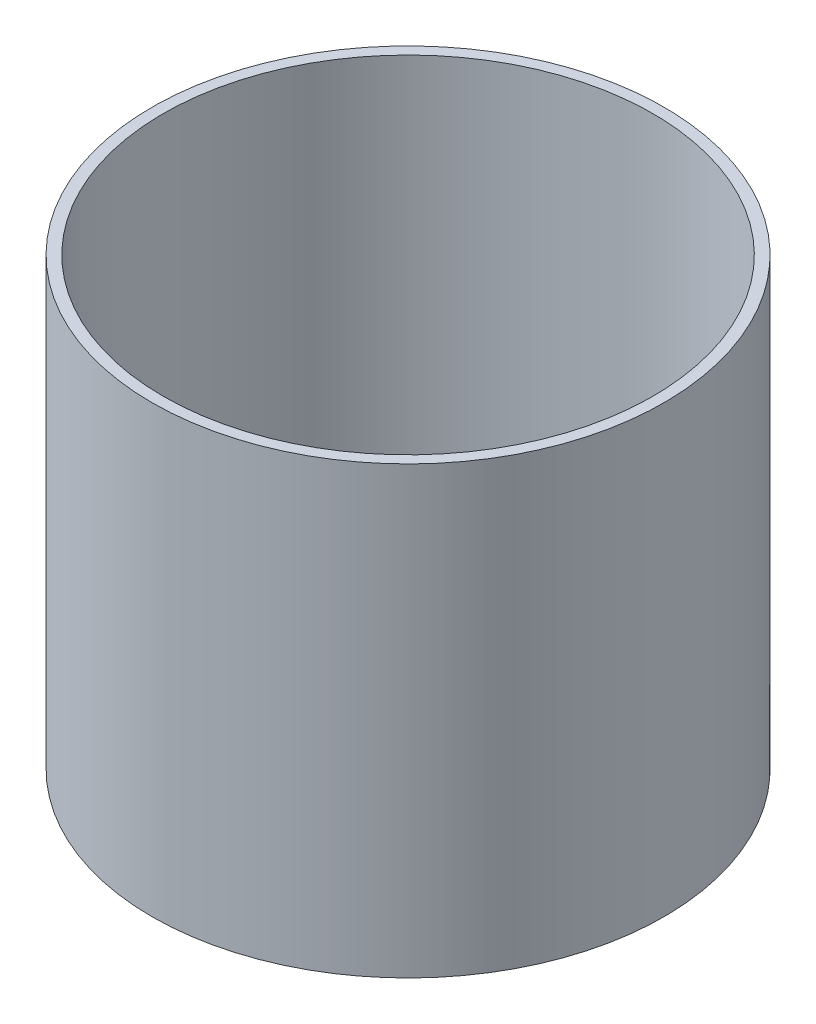
ISO-10303-21;
HEADER;
FILE_DESCRIPTION(('STEP AP214'),'2;1');
FILE_NAME('part.step','',(''),(''),'','','');
FILE_SCHEMA(('AUTOMOTIVE_DESIGN { 1 0 10303 214 1 1 1 1 }'));
ENDSEC;
DATA;
#1=APPLICATION_CONTEXT('core data for automotive mechanical design processes');
#2=APPLICATION_PROTOCOL_DEFINITION('international standard','automotive_design',2000,#1);
#3=PRODUCT_CONTEXT('',#1,'mechanical');
#4=PRODUCT('Part','Part','',(#3));
#5=PRODUCT_RELATED_PRODUCT_CATEGORY('part','',(#4));
#6=PRODUCT_DEFINITION_FORMATION('','',#4);
#7=PRODUCT_DEFINITION_CONTEXT('part definition',#1,'design');
#8=PRODUCT_DEFINITION('design','',#6,#7);
#9=PRODUCT_DEFINITION_SHAPE('','',#8);
#10=(LENGTH_UNIT() NAMED_UNIT(*) SI_UNIT(.MILLI.,.METRE.));
#11=(NAMED_UNIT(*) PLANE_ANGLE_UNIT() SI_UNIT($,.RADIAN.));
#12=(NAMED_UNIT(*) SI_UNIT($,.STERADIAN.) SOLID_ANGLE_UNIT());
#13=UNCERTAINTY_MEASURE_WITH_UNIT(LENGTH_MEASURE(1.E-05),#10,'distance_accuracy_value','');
#14=(GEOMETRIC_REPRESENTATION_CONTEXT(3) GLOBAL_UNCERTAINTY_ASSIGNED_CONTEXT((#13)) GLOBAL_UNIT_ASSIGNED_CONTEXT((#10,
#11,#12)) REPRESENTATION_CONTEXT('',''));
#15=CARTESIAN_POINT('',(0.,0.,0.));
#16=DIRECTION('',(0.,0.,1.));
#17=DIRECTION('',(1.,0.,0.));
#18=AXIS2_PLACEMENT_3D('',#15,#16,#17);
#19=CARTESIAN_POINT('',(0.,40.,0.));
#20=DIRECTION('',(0.,1.,0.));
#21=DIRECTION('',(0.,0.,1.));
#22=AXIS2_PLACEMENT_3D('',#19,#20,#21);
#23=PLANE('',#22);
#24=CARTESIAN_POINT('',(0.,40.,0.));
#25=DIRECTION('',(0.,1.,0.));
#26=DIRECTION('',(0.,0.,1.));
#27=AXIS2_PLACEMENT_3D('',#24,#25,#26);
#28=CIRCLE('',#27,23.);
#29=CARTESIAN_POINT('',(0.,40.,23.));
#30=VERTEX_POINT('',#29);
#31=EDGE_CURVE('E10',#30,#30,#28,.T.);
#32=ORIENTED_EDGE('',*,*,#31,.T.);
#33=EDGE_LOOP('',(#32));
#34=FACE_BOUND('',#33,.T.);
#35=CARTESIAN_POINT('',(0.,40.,0.));
#36=DIRECTION('',(0.,1.,0.));
#37=DIRECTION('',(0.,0.,1.));
#38=AXIS2_PLACEMENT_3D('',#35,#36,#37);
#39=CIRCLE('',#38,22.);
#40=CARTESIAN_POINT('',(0.,40.,22.));
#41=VERTEX_POINT('',#40);
#42=EDGE_CURVE('E51',#41,#41,#39,.T.);
#43=ORIENTED_EDGE('',*,*,#42,.F.);
#44=EDGE_LOOP('',(#43));
#45=FACE_BOUND('',#44,.T.);
#46=ADVANCED_FACE('F37',(#34,#45),#23,.T.);
#47=CARTESIAN_POINT('',(0.,0.,0.));
#48=DIRECTION('',(0.,1.,0.));
#49=DIRECTION('',(0.,0.,1.));
#50=AXIS2_PLACEMENT_3D('',#47,#48,#49);
#51=PLANE('',#50);
#52=CARTESIAN_POINT('',(0.,0.,0.));
#53=DIRECTION('',(0.,1.,0.));
#54=DIRECTION('',(0.,0.,1.));
#55=AXIS2_PLACEMENT_3D('',#52,#53,#54);
#56=CIRCLE('',#55,23.);
#57=CARTESIAN_POINT('',(0.,0.,23.));
#58=VERTEX_POINT('',#57);
#59=EDGE_CURVE('E42',#58,#58,#56,.T.);
#60=ORIENTED_EDGE('',*,*,#59,.F.);
#61=EDGE_LOOP('',(#60));
#62=FACE_BOUND('',#61,.T.);
#63=CARTESIAN_POINT('',(0.,0.,0.));
#64=DIRECTION('',(0.,1.,0.));
#65=DIRECTION('',(0.,0.,1.));
#66=AXIS2_PLACEMENT_3D('',#63,#64,#65);
#67=CIRCLE('',#66,22.);
#68=CARTESIAN_POINT('',(0.,0.,22.));
#69=VERTEX_POINT('',#68);
#70=EDGE_CURVE('E52',#69,#69,#67,.T.);
#71=ORIENTED_EDGE('',*,*,#70,.T.);
#72=EDGE_LOOP('',(#71));
#73=FACE_BOUND('',#72,.T.);
#74=ADVANCED_FACE('F61',(#62,#73),#51,.F.);
#75=CARTESIAN_POINT('',(0.,40.,0.));
#76=DIRECTION('',(0.,-1.,0.));
#77=DIRECTION('',(0.,0.,-1.));
#78=AXIS2_PLACEMENT_3D('',#75,#76,#77);
#79=CYLINDRICAL_SURFACE('',#78,23.);
#80=ORIENTED_EDGE('',*,*,#31,.F.);
#81=EDGE_LOOP('',(#80));
#82=FACE_BOUND('',#81,.T.);
#83=ORIENTED_EDGE('',*,*,#59,.T.);
#84=EDGE_LOOP('',(#83));
#85=FACE_BOUND('',#84,.T.);
#86=ADVANCED_FACE('F45',(#82,#85),#79,.T.);
#87=CARTESIAN_POINT('',(0.,40.,0.));
#88=DIRECTION('',(0.,-1.,0.));
#89=DIRECTION('',(0.,0.,-1.));
#90=AXIS2_PLACEMENT_3D('',#87,#88,#89);
#91=CYLINDRICAL_SURFACE('',#90,22.);
#92=ORIENTED_EDGE('',*,*,#42,.T.);
#93=EDGE_LOOP('',(#92));
#94=FACE_BOUND('',#93,.T.);
#95=ORIENTED_EDGE('',*,*,#70,.F.);
#96=EDGE_LOOP('',(#95));
#97=FACE_BOUND('',#96,.T.);
#98=ADVANCED_FACE('F56',(#94,#97),#91,.F.);
#99=CLOSED_SHELL('',(#46,#74,#86,#98));
#100=MANIFOLD_SOLID_BREP('B2',#99);
#101=ADVANCED_BREP_SHAPE_REPRESENTATION('',(#18,#100),#14);
#102=SHAPE_DEFINITION_REPRESENTATION(#9,#101);
ENDSEC;
END-ISO-10303-21;
